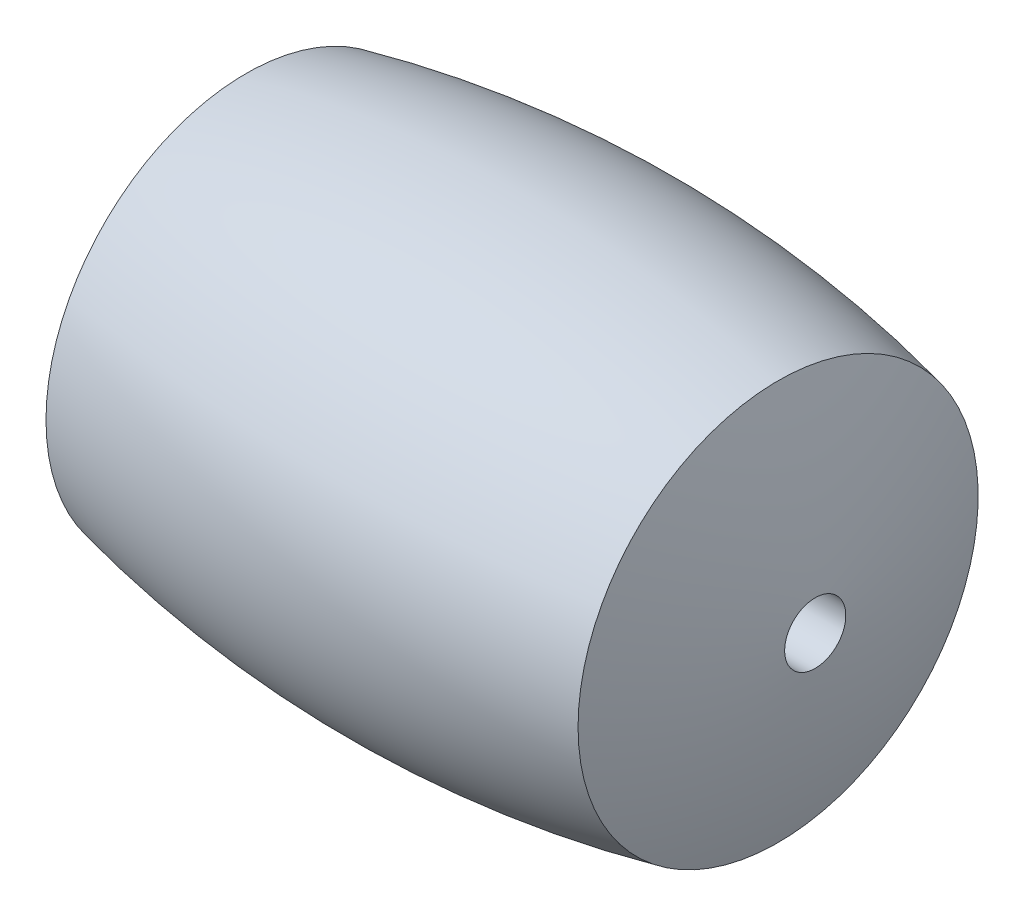
ISO-10303-21;
HEADER;
FILE_DESCRIPTION(('STEP AP214'),'2;1');
FILE_NAME('part.step','',(''),(''),'','','');
FILE_SCHEMA(('AUTOMOTIVE_DESIGN { 1 0 10303 214 1 1 1 1 }'));
ENDSEC;
DATA;
#1=APPLICATION_CONTEXT('core data for automotive mechanical design processes');
#2=APPLICATION_PROTOCOL_DEFINITION('international standard','automotive_design',2000,#1);
#3=PRODUCT_CONTEXT('',#1,'mechanical');
#4=PRODUCT('Part','Part','',(#3));
#5=PRODUCT_RELATED_PRODUCT_CATEGORY('part','',(#4));
#6=PRODUCT_DEFINITION_FORMATION('','',#4);
#7=PRODUCT_DEFINITION_CONTEXT('part definition',#1,'design');
#8=PRODUCT_DEFINITION('design','',#6,#7);
#9=PRODUCT_DEFINITION_SHAPE('','',#8);
#10=(LENGTH_UNIT() NAMED_UNIT(*) SI_UNIT(.MILLI.,.METRE.));
#11=(NAMED_UNIT(*) PLANE_ANGLE_UNIT() SI_UNIT($,.RADIAN.));
#12=(NAMED_UNIT(*) SI_UNIT($,.STERADIAN.) SOLID_ANGLE_UNIT());
#13=UNCERTAINTY_MEASURE_WITH_UNIT(LENGTH_MEASURE(1.E-05),#10,'distance_accuracy_value','');
#14=(GEOMETRIC_REPRESENTATION_CONTEXT(3) GLOBAL_UNCERTAINTY_ASSIGNED_CONTEXT((#13)) GLOBAL_UNIT_ASSIGNED_CONTEXT((#10,
#11,#12)) REPRESENTATION_CONTEXT('',''));
#15=CARTESIAN_POINT('',(0.,0.,0.));
#16=DIRECTION('',(0.,0.,1.));
#17=DIRECTION('',(1.,0.,0.));
#18=AXIS2_PLACEMENT_3D('',#15,#16,#17);
#19=CARTESIAN_POINT('',(10.0765105953765,0.,0.));
#20=DIRECTION('',(-1.,0.,0.));
#21=DIRECTION('',(0.,0.,1.));
#22=AXIS2_PLACEMENT_3D('',#19,#20,#21);
#23=DEGENERATE_TOROIDAL_SURFACE('',#22,1.10471581702896,16.4636158657936,.F.);
#24=CARTESIAN_POINT('',(-5.52451657886297,0.,0.));
#25=DIRECTION('',(-1.,0.,0.));
#26=DIRECTION('',(0.,0.,1.));
#27=AXIS2_PLACEMENT_3D('',#24,#25,#26);
#28=CIRCLE('',#27,4.15442845604932);
#29=CARTESIAN_POINT('',(-5.52451657886297,0.,4.15442845604932));
#30=VERTEX_POINT('',#29);
#31=EDGE_CURVE('E11',#30,#30,#28,.T.);
#32=ORIENTED_EDGE('',*,*,#31,.T.);
#33=EDGE_LOOP('',(#32));
#34=FACE_BOUND('',#33,.T.);
#35=CARTESIAN_POINT('',(-6.29492905580842,0.,0.));
#36=DIRECTION('',(1.,0.,0.));
#37=DIRECTION('',(0.,0.,-1.));
#38=AXIS2_PLACEMENT_3D('',#35,#36,#37);
#39=CIRCLE('',#38,0.635);
#40=CARTESIAN_POINT('',(-6.29492905580842,0.,-0.635000000000003));
#41=VERTEX_POINT('',#40);
#42=EDGE_CURVE('E44',#41,#41,#39,.F.);
#43=ORIENTED_EDGE('',*,*,#42,.F.);
#44=EDGE_LOOP('',(#43));
#45=FACE_BOUND('',#44,.T.);
#46=ADVANCED_FACE('F32',(#34,#45),#23,.F.);
#47=CARTESIAN_POINT('',(-10.0765105953766,0.,0.));
#48=DIRECTION('',(-1.,0.,0.));
#49=DIRECTION('',(0.,0.,1.));
#50=AXIS2_PLACEMENT_3D('',#47,#48,#49);
#51=DEGENERATE_TOROIDAL_SURFACE('',#50,1.10471581702896,16.4636158657936,.F.);
#52=CARTESIAN_POINT('',(5.52451657886297,0.,0.));
#53=DIRECTION('',(-1.,0.,0.));
#54=DIRECTION('',(0.,0.,1.));
#55=AXIS2_PLACEMENT_3D('',#52,#53,#54);
#56=CIRCLE('',#55,4.15442845604932);
#57=CARTESIAN_POINT('',(5.52451657886297,0.,4.15442845604932));
#58=VERTEX_POINT('',#57);
#59=EDGE_CURVE('E40',#58,#58,#56,.T.);
#60=ORIENTED_EDGE('',*,*,#59,.F.);
#61=EDGE_LOOP('',(#60));
#62=FACE_BOUND('',#61,.T.);
#63=CARTESIAN_POINT('',(6.29492905580841,0.,0.));
#64=DIRECTION('',(-1.,0.,0.));
#65=DIRECTION('',(0.,0.,1.));
#66=AXIS2_PLACEMENT_3D('',#63,#64,#65);
#67=CIRCLE('',#66,0.635);
#68=CARTESIAN_POINT('',(6.29492905580841,0.,0.634999999999997));
#69=VERTEX_POINT('',#68);
#70=EDGE_CURVE('E36',#69,#69,#67,.F.);
#71=ORIENTED_EDGE('',*,*,#70,.F.);
#72=EDGE_LOOP('',(#71));
#73=FACE_BOUND('',#72,.T.);
#74=ADVANCED_FACE('F55',(#62,#73),#51,.F.);
#75=CARTESIAN_POINT('',(0.,0.,0.));
#76=DIRECTION('',(-1.,0.,0.));
#77=DIRECTION('',(0.,0.,1.));
#78=AXIS2_PLACEMENT_3D('',#75,#76,#77);
#79=DEGENERATE_TOROIDAL_SURFACE('',#78,20.6375,25.4,.F.);
#80=ORIENTED_EDGE('',*,*,#31,.F.);
#81=EDGE_LOOP('',(#80));
#82=FACE_BOUND('',#81,.T.);
#83=ORIENTED_EDGE('',*,*,#59,.T.);
#84=EDGE_LOOP('',(#83));
#85=FACE_BOUND('',#84,.T.);
#86=ADVANCED_FACE('F34',(#82,#85),#79,.F.);
#87=CARTESIAN_POINT('',(0.,0.,0.));
#88=DIRECTION('',(-1.,0.,0.));
#89=DIRECTION('',(0.,0.,1.));
#90=AXIS2_PLACEMENT_3D('',#87,#88,#89);
#91=CYLINDRICAL_SURFACE('',#90,0.635);
#92=ORIENTED_EDGE('',*,*,#70,.T.);
#93=EDGE_LOOP('',(#92));
#94=FACE_BOUND('',#93,.T.);
#95=ORIENTED_EDGE('',*,*,#42,.T.);
#96=EDGE_LOOP('',(#95));
#97=FACE_BOUND('',#96,.T.);
#98=ADVANCED_FACE('F53',(#94,#97),#91,.F.);
#99=CLOSED_SHELL('',(#46,#74,#86,#98));
#100=MANIFOLD_SOLID_BREP('B2',#99);
#101=ADVANCED_BREP_SHAPE_REPRESENTATION('',(#18,#100),#14);
#102=SHAPE_DEFINITION_REPRESENTATION(#9,#101);
ENDSEC;
END-ISO-10303-21;
